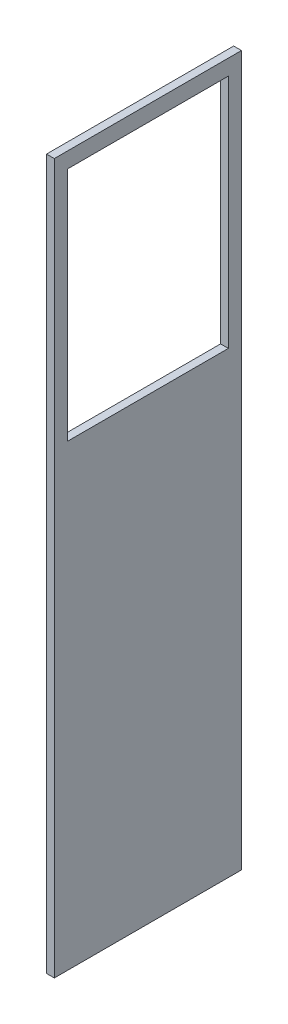
ISO-10303-21;
HEADER;
FILE_DESCRIPTION(('STEP AP214'),'2;1');
FILE_NAME('part.step','',(''),(''),'','','');
FILE_SCHEMA(('AUTOMOTIVE_DESIGN { 1 0 10303 214 1 1 1 1 }'));
ENDSEC;
DATA;
#1=APPLICATION_CONTEXT('core data for automotive mechanical design processes');
#2=APPLICATION_PROTOCOL_DEFINITION('international standard','automotive_design',2000,#1);
#3=PRODUCT_CONTEXT('',#1,'mechanical');
#4=PRODUCT('Part','Part','',(#3));
#5=PRODUCT_RELATED_PRODUCT_CATEGORY('part','',(#4));
#6=PRODUCT_DEFINITION_FORMATION('','',#4);
#7=PRODUCT_DEFINITION_CONTEXT('part definition',#1,'design');
#8=PRODUCT_DEFINITION('design','',#6,#7);
#9=PRODUCT_DEFINITION_SHAPE('','',#8);
#10=(LENGTH_UNIT() NAMED_UNIT(*) SI_UNIT(.MILLI.,.METRE.));
#11=(NAMED_UNIT(*) PLANE_ANGLE_UNIT() SI_UNIT($,.RADIAN.));
#12=(NAMED_UNIT(*) SI_UNIT($,.STERADIAN.) SOLID_ANGLE_UNIT());
#13=UNCERTAINTY_MEASURE_WITH_UNIT(LENGTH_MEASURE(1.E-05),#10,'distance_accuracy_value','');
#14=(GEOMETRIC_REPRESENTATION_CONTEXT(3) GLOBAL_UNCERTAINTY_ASSIGNED_CONTEXT((#13)) GLOBAL_UNIT_ASSIGNED_CONTEXT((#10,
#11,#12)) REPRESENTATION_CONTEXT('',''));
#15=CARTESIAN_POINT('',(0.,0.,0.));
#16=DIRECTION('',(0.,0.,1.));
#17=DIRECTION('',(1.,0.,0.));
#18=AXIS2_PLACEMENT_3D('',#15,#16,#17);
#19=CARTESIAN_POINT('',(3.175,0.,0.));
#20=DIRECTION('',(0.,0.,-1.));
#21=DIRECTION('',(0.,1.,0.));
#22=AXIS2_PLACEMENT_3D('',#19,#20,#21);
#23=PLANE('',#22);
#24=DIRECTION('',(0.,-1.,0.));
#25=VECTOR('',#24,1.);
#26=CARTESIAN_POINT('',(0.,0.,0.));
#27=LINE('',#26,#25);
#28=CARTESIAN_POINT('',(0.,288.925,0.));
#29=VERTEX_POINT('',#28);
#30=CARTESIAN_POINT('',(0.,0.,0.));
#31=VERTEX_POINT('',#30);
#32=EDGE_CURVE('E111',#29,#31,#27,.T.);
#33=ORIENTED_EDGE('',*,*,#32,.T.);
#34=DIRECTION('',(-1.,0.,0.));
#35=VECTOR('',#34,1.);
#36=CARTESIAN_POINT('',(3.175,0.,0.));
#37=LINE('',#36,#35);
#38=CARTESIAN_POINT('',(3.175,0.,0.));
#39=VERTEX_POINT('',#38);
#40=EDGE_CURVE('E11',#39,#31,#37,.T.);
#41=ORIENTED_EDGE('',*,*,#40,.F.);
#42=DIRECTION('',(0.,-1.,0.));
#43=VECTOR('',#42,1.);
#44=CARTESIAN_POINT('',(3.175,0.,0.));
#45=LINE('',#44,#43);
#46=CARTESIAN_POINT('',(3.175,288.925,0.));
#47=VERTEX_POINT('',#46);
#48=EDGE_CURVE('E134',#47,#39,#45,.T.);
#49=ORIENTED_EDGE('',*,*,#48,.F.);
#50=DIRECTION('',(-1.,0.,0.));
#51=VECTOR('',#50,1.);
#52=CARTESIAN_POINT('',(3.175,288.925,0.));
#53=LINE('',#52,#51);
#54=EDGE_CURVE('E144',#47,#29,#53,.T.);
#55=ORIENTED_EDGE('',*,*,#54,.T.);
#56=EDGE_LOOP('',(#33,#41,#49,#55));
#57=FACE_BOUND('',#56,.T.);
#58=ADVANCED_FACE('F33',(#57),#23,.F.);
#59=CARTESIAN_POINT('',(3.175,0.,0.));
#60=DIRECTION('',(0.,1.,0.));
#61=DIRECTION('',(0.,0.,1.));
#62=AXIS2_PLACEMENT_3D('',#59,#60,#61);
#63=PLANE('',#62);
#64=DIRECTION('',(0.,0.,-1.));
#65=VECTOR('',#64,1.);
#66=CARTESIAN_POINT('',(0.,0.,0.));
#67=LINE('',#66,#65);
#68=CARTESIAN_POINT('',(0.,0.,-76.2));
#69=VERTEX_POINT('',#68);
#70=EDGE_CURVE('E147',#31,#69,#67,.T.);
#71=ORIENTED_EDGE('',*,*,#70,.T.);
#72=DIRECTION('',(-1.,0.,0.));
#73=VECTOR('',#72,1.);
#74=CARTESIAN_POINT('',(3.175,0.,-76.2));
#75=LINE('',#74,#73);
#76=CARTESIAN_POINT('',(3.175,0.,-76.2));
#77=VERTEX_POINT('',#76);
#78=EDGE_CURVE('E40',#77,#69,#75,.T.);
#79=ORIENTED_EDGE('',*,*,#78,.F.);
#80=DIRECTION('',(0.,0.,-1.));
#81=VECTOR('',#80,1.);
#82=CARTESIAN_POINT('',(3.175,0.,0.));
#83=LINE('',#82,#81);
#84=EDGE_CURVE('E137',#39,#77,#83,.T.);
#85=ORIENTED_EDGE('',*,*,#84,.F.);
#86=ORIENTED_EDGE('',*,*,#40,.T.);
#87=EDGE_LOOP('',(#71,#79,#85,#86));
#88=FACE_BOUND('',#87,.T.);
#89=ADVANCED_FACE('F175',(#88),#63,.F.);
#90=CARTESIAN_POINT('',(3.175,0.,-76.2));
#91=DIRECTION('',(0.,0.,1.));
#92=DIRECTION('',(0.,-1.,0.));
#93=AXIS2_PLACEMENT_3D('',#90,#91,#92);
#94=PLANE('',#93);
#95=DIRECTION('',(0.,1.,0.));
#96=VECTOR('',#95,1.);
#97=CARTESIAN_POINT('',(0.,0.,-76.2));
#98=LINE('',#97,#96);
#99=CARTESIAN_POINT('',(0.,288.925,-76.1999999999999));
#100=VERTEX_POINT('',#99);
#101=EDGE_CURVE('E149',#69,#100,#98,.T.);
#102=ORIENTED_EDGE('',*,*,#101,.T.);
#103=DIRECTION('',(-1.,0.,0.));
#104=VECTOR('',#103,1.);
#105=CARTESIAN_POINT('',(3.175,288.925,-76.1999999999999));
#106=LINE('',#105,#104);
#107=CARTESIAN_POINT('',(3.175,288.925,-76.1999999999999));
#108=VERTEX_POINT('',#107);
#109=EDGE_CURVE('E154',#108,#100,#106,.T.);
#110=ORIENTED_EDGE('',*,*,#109,.F.);
#111=DIRECTION('',(0.,1.,0.));
#112=VECTOR('',#111,1.);
#113=CARTESIAN_POINT('',(3.175,0.,-76.2));
#114=LINE('',#113,#112);
#115=EDGE_CURVE('E140',#77,#108,#114,.T.);
#116=ORIENTED_EDGE('',*,*,#115,.F.);
#117=ORIENTED_EDGE('',*,*,#78,.T.);
#118=EDGE_LOOP('',(#102,#110,#116,#117));
#119=FACE_BOUND('',#118,.T.);
#120=ADVANCED_FACE('F161',(#119),#94,.F.);
#121=CARTESIAN_POINT('',(3.175,288.925,0.));
#122=DIRECTION('',(0.,-1.,0.));
#123=DIRECTION('',(0.,0.,-1.));
#124=AXIS2_PLACEMENT_3D('',#121,#122,#123);
#125=PLANE('',#124);
#126=DIRECTION('',(0.,0.,1.));
#127=VECTOR('',#126,1.);
#128=CARTESIAN_POINT('',(0.,288.925,0.));
#129=LINE('',#128,#127);
#130=EDGE_CURVE('E138',#100,#29,#129,.T.);
#131=ORIENTED_EDGE('',*,*,#130,.T.);
#132=ORIENTED_EDGE('',*,*,#54,.F.);
#133=DIRECTION('',(0.,0.,1.));
#134=VECTOR('',#133,1.);
#135=CARTESIAN_POINT('',(3.175,288.925,0.));
#136=LINE('',#135,#134);
#137=EDGE_CURVE('E142',#108,#47,#136,.T.);
#138=ORIENTED_EDGE('',*,*,#137,.F.);
#139=ORIENTED_EDGE('',*,*,#109,.T.);
#140=EDGE_LOOP('',(#131,#132,#138,#139));
#141=FACE_BOUND('',#140,.T.);
#142=ADVANCED_FACE('F170',(#141),#125,.F.);
#143=CARTESIAN_POINT('',(3.175,0.,0.));
#144=DIRECTION('',(-1.,0.,0.));
#145=DIRECTION('',(0.,0.,1.));
#146=AXIS2_PLACEMENT_3D('',#143,#144,#145);
#147=PLANE('',#146);
#148=DIRECTION('',(0.,0.,1.));
#149=VECTOR('',#148,1.);
#150=CARTESIAN_POINT('',(3.175,282.575,-70.8659999999999));
#151=LINE('',#150,#149);
#152=CARTESIAN_POINT('',(3.175,282.575,-70.8659999999999));
#153=VERTEX_POINT('',#152);
#154=CARTESIAN_POINT('',(3.175,282.575,-5.33399999999995));
#155=VERTEX_POINT('',#154);
#156=EDGE_CURVE('E117',#153,#155,#151,.T.);
#157=ORIENTED_EDGE('',*,*,#156,.F.);
#158=DIRECTION('',(0.,1.,0.));
#159=VECTOR('',#158,1.);
#160=CARTESIAN_POINT('',(3.175,186.563,-70.8659999999999));
#161=LINE('',#160,#159);
#162=CARTESIAN_POINT('',(3.175,186.563,-70.8659999999999));
#163=VERTEX_POINT('',#162);
#164=EDGE_CURVE('E99',#163,#153,#161,.T.);
#165=ORIENTED_EDGE('',*,*,#164,.F.);
#166=DIRECTION('',(0.,0.,-1.));
#167=VECTOR('',#166,1.);
#168=CARTESIAN_POINT('',(3.175,186.563,-70.8659999999999));
#169=LINE('',#168,#167);
#170=CARTESIAN_POINT('',(3.175,186.563,-5.33399999999995));
#171=VERTEX_POINT('',#170);
#172=EDGE_CURVE('E108',#171,#163,#169,.T.);
#173=ORIENTED_EDGE('',*,*,#172,.F.);
#174=DIRECTION('',(0.,-1.,0.));
#175=VECTOR('',#174,1.);
#176=CARTESIAN_POINT('',(3.175,186.563,-5.33399999999995));
#177=LINE('',#176,#175);
#178=EDGE_CURVE('E47',#155,#171,#177,.T.);
#179=ORIENTED_EDGE('',*,*,#178,.F.);
#180=EDGE_LOOP('',(#157,#165,#173,#179));
#181=FACE_BOUND('',#180,.T.);
#182=ORIENTED_EDGE('',*,*,#48,.T.);
#183=ORIENTED_EDGE('',*,*,#84,.T.);
#184=ORIENTED_EDGE('',*,*,#115,.T.);
#185=ORIENTED_EDGE('',*,*,#137,.T.);
#186=EDGE_LOOP('',(#182,#183,#184,#185));
#187=FACE_BOUND('',#186,.T.);
#188=ADVANCED_FACE('F114',(#181,#187),#147,.F.);
#189=CARTESIAN_POINT('',(0.,0.,0.));
#190=DIRECTION('',(-1.,0.,0.));
#191=DIRECTION('',(0.,0.,1.));
#192=AXIS2_PLACEMENT_3D('',#189,#190,#191);
#193=PLANE('',#192);
#194=DIRECTION('',(0.,-1.,0.));
#195=VECTOR('',#194,1.);
#196=CARTESIAN_POINT('',(0.,186.563,-70.8659999999999));
#197=LINE('',#196,#195);
#198=CARTESIAN_POINT('',(0.,282.575,-70.8659999999999));
#199=VERTEX_POINT('',#198);
#200=CARTESIAN_POINT('',(0.,186.563,-70.8659999999999));
#201=VERTEX_POINT('',#200);
#202=EDGE_CURVE('E55',#199,#201,#197,.T.);
#203=ORIENTED_EDGE('',*,*,#202,.F.);
#204=DIRECTION('',(0.,0.,-1.));
#205=VECTOR('',#204,1.);
#206=CARTESIAN_POINT('',(0.,282.575,-70.8659999999999));
#207=LINE('',#206,#205);
#208=CARTESIAN_POINT('',(0.,282.575,-5.33399999999995));
#209=VERTEX_POINT('',#208);
#210=EDGE_CURVE('E105',#209,#199,#207,.T.);
#211=ORIENTED_EDGE('',*,*,#210,.F.);
#212=DIRECTION('',(0.,1.,0.));
#213=VECTOR('',#212,1.);
#214=CARTESIAN_POINT('',(0.,186.563,-5.33399999999995));
#215=LINE('',#214,#213);
#216=CARTESIAN_POINT('',(0.,186.563,-5.33399999999995));
#217=VERTEX_POINT('',#216);
#218=EDGE_CURVE('E125',#217,#209,#215,.T.);
#219=ORIENTED_EDGE('',*,*,#218,.F.);
#220=DIRECTION('',(0.,0.,1.));
#221=VECTOR('',#220,1.);
#222=CARTESIAN_POINT('',(0.,186.563,-70.8659999999999));
#223=LINE('',#222,#221);
#224=EDGE_CURVE('E119',#201,#217,#223,.T.);
#225=ORIENTED_EDGE('',*,*,#224,.F.);
#226=EDGE_LOOP('',(#203,#211,#219,#225));
#227=FACE_BOUND('',#226,.T.);
#228=ORIENTED_EDGE('',*,*,#32,.F.);
#229=ORIENTED_EDGE('',*,*,#130,.F.);
#230=ORIENTED_EDGE('',*,*,#101,.F.);
#231=ORIENTED_EDGE('',*,*,#70,.F.);
#232=EDGE_LOOP('',(#228,#229,#230,#231));
#233=FACE_BOUND('',#232,.T.);
#234=ADVANCED_FACE('F167',(#227,#233),#193,.T.);
#235=CARTESIAN_POINT('',(3.176,186.563,-70.8659999999999));
#236=DIRECTION('',(0.,0.,-1.));
#237=DIRECTION('',(-1.,0.,0.));
#238=AXIS2_PLACEMENT_3D('',#235,#236,#237);
#239=PLANE('',#238);
#240=ORIENTED_EDGE('',*,*,#164,.T.);
#241=DIRECTION('',(-1.,0.,0.));
#242=VECTOR('',#241,1.);
#243=CARTESIAN_POINT('',(3.176,282.575,-70.8659999999999));
#244=LINE('',#243,#242);
#245=EDGE_CURVE('E112',#153,#199,#244,.T.);
#246=ORIENTED_EDGE('',*,*,#245,.T.);
#247=ORIENTED_EDGE('',*,*,#202,.T.);
#248=DIRECTION('',(-1.,0.,0.));
#249=VECTOR('',#248,1.);
#250=CARTESIAN_POINT('',(3.176,186.563,-70.8659999999999));
#251=LINE('',#250,#249);
#252=EDGE_CURVE('E95',#163,#201,#251,.T.);
#253=ORIENTED_EDGE('',*,*,#252,.F.);
#254=EDGE_LOOP('',(#240,#246,#247,#253));
#255=FACE_BOUND('',#254,.T.);
#256=ADVANCED_FACE('F97',(#255),#239,.F.);
#257=CARTESIAN_POINT('',(3.176,282.575,-70.8659999999999));
#258=DIRECTION('',(0.,1.,0.));
#259=DIRECTION('',(0.,0.,1.));
#260=AXIS2_PLACEMENT_3D('',#257,#258,#259);
#261=PLANE('',#260);
#262=ORIENTED_EDGE('',*,*,#156,.T.);
#263=DIRECTION('',(-1.,0.,0.));
#264=VECTOR('',#263,1.);
#265=CARTESIAN_POINT('',(3.176,282.575,-5.33399999999995));
#266=LINE('',#265,#264);
#267=EDGE_CURVE('E131',#155,#209,#266,.T.);
#268=ORIENTED_EDGE('',*,*,#267,.T.);
#269=ORIENTED_EDGE('',*,*,#210,.T.);
#270=ORIENTED_EDGE('',*,*,#245,.F.);
#271=EDGE_LOOP('',(#262,#268,#269,#270));
#272=FACE_BOUND('',#271,.T.);
#273=ADVANCED_FACE('F192',(#272),#261,.F.);
#274=CARTESIAN_POINT('',(3.176,186.563,-5.33399999999995));
#275=DIRECTION('',(0.,0.,1.));
#276=DIRECTION('',(1.,0.,0.));
#277=AXIS2_PLACEMENT_3D('',#274,#275,#276);
#278=PLANE('',#277);
#279=ORIENTED_EDGE('',*,*,#178,.T.);
#280=DIRECTION('',(-1.,0.,0.));
#281=VECTOR('',#280,1.);
#282=CARTESIAN_POINT('',(3.176,186.563,-5.33399999999995));
#283=LINE('',#282,#281);
#284=EDGE_CURVE('E104',#171,#217,#283,.T.);
#285=ORIENTED_EDGE('',*,*,#284,.T.);
#286=ORIENTED_EDGE('',*,*,#218,.T.);
#287=ORIENTED_EDGE('',*,*,#267,.F.);
#288=EDGE_LOOP('',(#279,#285,#286,#287));
#289=FACE_BOUND('',#288,.T.);
#290=ADVANCED_FACE('F195',(#289),#278,.F.);
#291=CARTESIAN_POINT('',(3.176,186.563,-70.8659999999999));
#292=DIRECTION('',(0.,-1.,0.));
#293=DIRECTION('',(0.,0.,-1.));
#294=AXIS2_PLACEMENT_3D('',#291,#292,#293);
#295=PLANE('',#294);
#296=ORIENTED_EDGE('',*,*,#172,.T.);
#297=ORIENTED_EDGE('',*,*,#252,.T.);
#298=ORIENTED_EDGE('',*,*,#224,.T.);
#299=ORIENTED_EDGE('',*,*,#284,.F.);
#300=EDGE_LOOP('',(#296,#297,#298,#299));
#301=FACE_BOUND('',#300,.T.);
#302=ADVANCED_FACE('F109',(#301),#295,.F.);
#303=CLOSED_SHELL('',(#58,#89,#120,#142,#188,#234,#256,#273,#290,#302));
#304=MANIFOLD_SOLID_BREP('B2',#303);
#305=ADVANCED_BREP_SHAPE_REPRESENTATION('',(#18,#304),#14);
#306=SHAPE_DEFINITION_REPRESENTATION(#9,#305);
ENDSEC;
END-ISO-10303-21;
